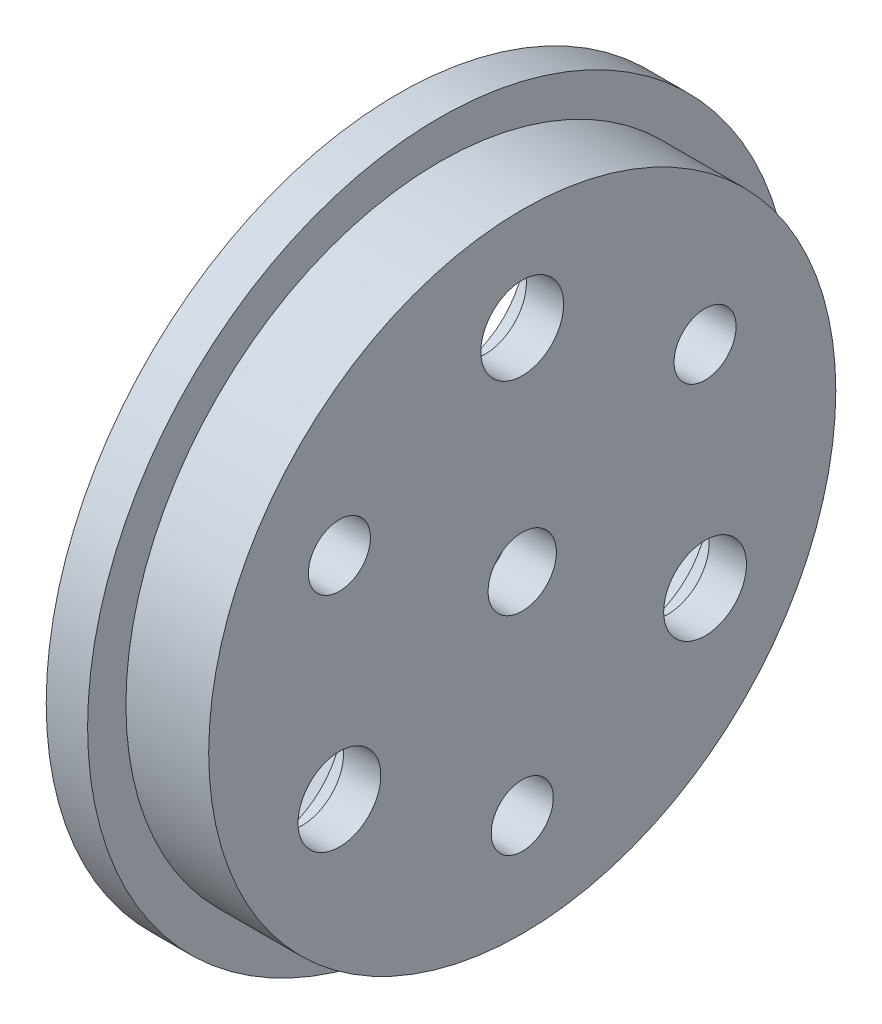
ISO-10303-21;
HEADER;
FILE_DESCRIPTION(('STEP AP214'),'2;1');
FILE_NAME('part.step','',(''),(''),'','','');
FILE_SCHEMA(('AUTOMOTIVE_DESIGN { 1 0 10303 214 1 1 1 1 }'));
ENDSEC;
DATA;
#1=APPLICATION_CONTEXT('core data for automotive mechanical design processes');
#2=APPLICATION_PROTOCOL_DEFINITION('international standard','automotive_design',2000,#1);
#3=PRODUCT_CONTEXT('',#1,'mechanical');
#4=PRODUCT('Part','Part','',(#3));
#5=PRODUCT_RELATED_PRODUCT_CATEGORY('part','',(#4));
#6=PRODUCT_DEFINITION_FORMATION('','',#4);
#7=PRODUCT_DEFINITION_CONTEXT('part definition',#1,'design');
#8=PRODUCT_DEFINITION('design','',#6,#7);
#9=PRODUCT_DEFINITION_SHAPE('','',#8);
#10=(LENGTH_UNIT() NAMED_UNIT(*) SI_UNIT(.MILLI.,.METRE.));
#11=(NAMED_UNIT(*) PLANE_ANGLE_UNIT() SI_UNIT($,.RADIAN.));
#12=(NAMED_UNIT(*) SI_UNIT($,.STERADIAN.) SOLID_ANGLE_UNIT());
#13=UNCERTAINTY_MEASURE_WITH_UNIT(LENGTH_MEASURE(1.E-05),#10,'distance_accuracy_value','');
#14=(GEOMETRIC_REPRESENTATION_CONTEXT(3) GLOBAL_UNCERTAINTY_ASSIGNED_CONTEXT((#13)) GLOBAL_UNIT_ASSIGNED_CONTEXT((#10,
#11,#12)) REPRESENTATION_CONTEXT('',''));
#15=CARTESIAN_POINT('',(0.,0.,0.));
#16=DIRECTION('',(0.,0.,1.));
#17=DIRECTION('',(1.,0.,0.));
#18=AXIS2_PLACEMENT_3D('',#15,#16,#17);
#19=CARTESIAN_POINT('',(2.6,-8.99999999999998,-9.52627944162879));
#20=DIRECTION('',(0.,-1.,0.));
#21=DIRECTION('',(0.,0.,-1.));
#22=AXIS2_PLACEMENT_3D('',#19,#20,#21);
#23=PLANE('',#22);
#24=DIRECTION('',(0.,0.,1.));
#25=VECTOR('',#24,1.);
#26=CARTESIAN_POINT('',(0.,-8.99999999999998,-9.52627944162879));
#27=LINE('',#26,#25);
#28=CARTESIAN_POINT('',(0.,-8.99999999999998,-9.52627944162879));
#29=VERTEX_POINT('',#28);
#30=CARTESIAN_POINT('',(0.,-8.99999999999999,-0.900000000001651));
#31=VERTEX_POINT('',#30);
#32=EDGE_CURVE('E145',#29,#31,#27,.T.);
#33=ORIENTED_EDGE('',*,*,#32,.T.);
#34=DIRECTION('',(1.,0.,0.));
#35=VECTOR('',#34,1.);
#36=CARTESIAN_POINT('',(0.,-8.99999999999999,-0.900000000001652));
#37=LINE('',#36,#35);
#38=CARTESIAN_POINT('',(2.6,-8.99999999999999,-0.900000000001651));
#39=VERTEX_POINT('',#38);
#40=EDGE_CURVE('E126',#31,#39,#37,.T.);
#41=ORIENTED_EDGE('',*,*,#40,.T.);
#42=DIRECTION('',(0.,0.,1.));
#43=VECTOR('',#42,1.);
#44=CARTESIAN_POINT('',(2.6,-8.99999999999998,-9.52627944162879));
#45=LINE('',#44,#43);
#46=CARTESIAN_POINT('',(2.6,-8.99999999999998,-9.52627944162879));
#47=VERTEX_POINT('',#46);
#48=EDGE_CURVE('E188',#47,#39,#45,.T.);
#49=ORIENTED_EDGE('',*,*,#48,.F.);
#50=DIRECTION('',(-1.,0.,0.));
#51=VECTOR('',#50,1.);
#52=CARTESIAN_POINT('',(2.6,-8.99999999999998,-9.52627944162879));
#53=LINE('',#52,#51);
#54=EDGE_CURVE('E152',#47,#29,#53,.T.);
#55=ORIENTED_EDGE('',*,*,#54,.T.);
#56=EDGE_LOOP('',(#33,#41,#49,#55));
#57=FACE_BOUND('',#56,.T.);
#58=ADVANCED_FACE('F39',(#57),#23,.F.);
#59=CARTESIAN_POINT('',(2.6,12.75,-3.03108891324556));
#60=DIRECTION('',(0.,0.500000000000001,-0.866025403784438));
#61=DIRECTION('',(0.,0.866025403784438,0.500000000000001));
#62=AXIS2_PLACEMENT_3D('',#59,#60,#61);
#63=PLANE('',#62);
#64=DIRECTION('',(0.,-0.866025403784438,-0.500000000000001));
#65=VECTOR('',#64,1.);
#66=CARTESIAN_POINT('',(0.,12.75,-3.03108891324556));
#67=LINE('',#66,#65);
#68=CARTESIAN_POINT('',(0.,12.75,-3.03108891324556));
#69=VERTEX_POINT('',#68);
#70=CARTESIAN_POINT('',(0.,5.27942286340726,-7.34422863405923));
#71=VERTEX_POINT('',#70);
#72=EDGE_CURVE('E274',#69,#71,#67,.T.);
#73=ORIENTED_EDGE('',*,*,#72,.T.);
#74=DIRECTION('',(1.,0.,0.));
#75=VECTOR('',#74,1.);
#76=CARTESIAN_POINT('',(0.,5.27942286340726,-7.34422863405923));
#77=LINE('',#76,#75);
#78=CARTESIAN_POINT('',(2.6,5.27942286340726,-7.34422863405923));
#79=VERTEX_POINT('',#78);
#80=EDGE_CURVE('E322',#71,#79,#77,.T.);
#81=ORIENTED_EDGE('',*,*,#80,.T.);
#82=DIRECTION('',(0.,-0.866025403784438,-0.500000000000001));
#83=VECTOR('',#82,1.);
#84=CARTESIAN_POINT('',(2.6,12.75,-3.03108891324556));
#85=LINE('',#84,#83);
#86=CARTESIAN_POINT('',(2.6,12.75,-3.03108891324556));
#87=VERTEX_POINT('',#86);
#88=EDGE_CURVE('E252',#87,#79,#85,.T.);
#89=ORIENTED_EDGE('',*,*,#88,.F.);
#90=DIRECTION('',(-1.,0.,0.));
#91=VECTOR('',#90,1.);
#92=CARTESIAN_POINT('',(2.6,12.75,-3.03108891324556));
#93=LINE('',#92,#91);
#94=EDGE_CURVE('E177',#87,#69,#93,.T.);
#95=ORIENTED_EDGE('',*,*,#94,.T.);
#96=EDGE_LOOP('',(#73,#81,#89,#95));
#97=FACE_BOUND('',#96,.T.);
#98=ADVANCED_FACE('F391',(#97),#63,.F.);
#99=CARTESIAN_POINT('',(2.6,-3.74999999999996,12.5573683548743));
#100=DIRECTION('',(0.,0.5,0.866025403784439));
#101=DIRECTION('',(0.,-0.866025403784439,0.5));
#102=AXIS2_PLACEMENT_3D('',#99,#100,#101);
#103=PLANE('',#102);
#104=DIRECTION('',(0.,0.866025403784439,-0.5));
#105=VECTOR('',#104,1.);
#106=CARTESIAN_POINT('',(0.,-3.74999999999996,12.5573683548743));
#107=LINE('',#106,#105);
#108=CARTESIAN_POINT('',(0.,-3.74999999999996,12.5573683548743));
#109=VERTEX_POINT('',#108);
#110=CARTESIAN_POINT('',(0.,3.72057713659398,8.24422863405995));
#111=VERTEX_POINT('',#110);
#112=EDGE_CURVE('E236',#109,#111,#107,.T.);
#113=ORIENTED_EDGE('',*,*,#112,.T.);
#114=DIRECTION('',(1.,0.,0.));
#115=VECTOR('',#114,1.);
#116=CARTESIAN_POINT('',(0.,3.72057713659398,8.24422863405995));
#117=LINE('',#116,#115);
#118=CARTESIAN_POINT('',(2.6,3.72057713659398,8.24422863405995));
#119=VERTEX_POINT('',#118);
#120=EDGE_CURVE('E224',#111,#119,#117,.T.);
#121=ORIENTED_EDGE('',*,*,#120,.T.);
#122=DIRECTION('',(0.,0.866025403784439,-0.5));
#123=VECTOR('',#122,1.);
#124=CARTESIAN_POINT('',(2.6,-3.74999999999996,12.5573683548743));
#125=LINE('',#124,#123);
#126=CARTESIAN_POINT('',(2.6,-3.74999999999996,12.5573683548743));
#127=VERTEX_POINT('',#126);
#128=EDGE_CURVE('E234',#127,#119,#125,.T.);
#129=ORIENTED_EDGE('',*,*,#128,.F.);
#130=DIRECTION('',(-1.,0.,0.));
#131=VECTOR('',#130,1.);
#132=CARTESIAN_POINT('',(2.6,-3.74999999999996,12.5573683548743));
#133=LINE('',#132,#131);
#134=EDGE_CURVE('E184',#127,#109,#133,.T.);
#135=ORIENTED_EDGE('',*,*,#134,.T.);
#136=EDGE_LOOP('',(#113,#121,#129,#135));
#137=FACE_BOUND('',#136,.T.);
#138=ADVANCED_FACE('F233',(#137),#103,.F.);
#139=CARTESIAN_POINT('',(2.,0.,0.));
#140=DIRECTION('',(-1.,0.,0.));
#141=DIRECTION('',(0.,0.,1.));
#142=AXIS2_PLACEMENT_3D('',#139,#140,#141);
#143=CYLINDRICAL_SURFACE('',#142,17.);
#144=CARTESIAN_POINT('',(2.,0.,0.));
#145=DIRECTION('',(1.,0.,0.));
#146=DIRECTION('',(0.,0.,-1.));
#147=AXIS2_PLACEMENT_3D('',#144,#145,#146);
#148=CIRCLE('',#147,17.);
#149=CARTESIAN_POINT('',(2.,0.,-17.));
#150=VERTEX_POINT('',#149);
#151=EDGE_CURVE('E197',#150,#150,#148,.T.);
#152=ORIENTED_EDGE('',*,*,#151,.F.);
#153=EDGE_LOOP('',(#152));
#154=FACE_BOUND('',#153,.T.);
#155=CARTESIAN_POINT('',(0.,0.,0.));
#156=DIRECTION('',(1.,0.,0.));
#157=DIRECTION('',(0.,0.,-1.));
#158=AXIS2_PLACEMENT_3D('',#155,#156,#157);
#159=CIRCLE('',#158,17.);
#160=CARTESIAN_POINT('',(0.,0.,-17.));
#161=VERTEX_POINT('',#160);
#162=EDGE_CURVE('E192',#161,#161,#159,.T.);
#163=ORIENTED_EDGE('',*,*,#162,.T.);
#164=EDGE_LOOP('',(#163));
#165=FACE_BOUND('',#164,.T.);
#166=ADVANCED_FACE('F41',(#154,#165),#143,.T.);
#167=CARTESIAN_POINT('',(2.,0.,0.));
#168=DIRECTION('',(1.,0.,0.));
#169=DIRECTION('',(0.,0.,-1.));
#170=AXIS2_PLACEMENT_3D('',#167,#168,#169);
#171=PLANE('',#170);
#172=CARTESIAN_POINT('',(2.,0.,0.));
#173=DIRECTION('',(1.,0.,0.));
#174=DIRECTION('',(0.,0.,-1.));
#175=AXIS2_PLACEMENT_3D('',#172,#173,#174);
#176=CIRCLE('',#175,15.15);
#177=CARTESIAN_POINT('',(2.,0.,-15.15));
#178=VERTEX_POINT('',#177);
#179=EDGE_CURVE('E193',#178,#178,#176,.T.);
#180=ORIENTED_EDGE('',*,*,#179,.F.);
#181=EDGE_LOOP('',(#180));
#182=FACE_BOUND('',#181,.T.);
#183=ORIENTED_EDGE('',*,*,#151,.T.);
#184=EDGE_LOOP('',(#183));
#185=FACE_BOUND('',#184,.T.);
#186=ADVANCED_FACE('F415',(#182,#185),#171,.T.);
#187=CARTESIAN_POINT('',(0.,0.,0.));
#188=DIRECTION('',(1.,0.,0.));
#189=DIRECTION('',(0.,0.,-1.));
#190=AXIS2_PLACEMENT_3D('',#187,#188,#189);
#191=PLANE('',#190);
#192=CARTESIAN_POINT('',(0.,3.72057713659391,-8.24422863406001));
#193=VERTEX_POINT('',#192);
#194=CARTESIAN_POINT('',(0.,-3.74999999999994,-12.5573683548743));
#195=VERTEX_POINT('',#194);
#196=EDGE_CURVE('E273',#193,#195,#67,.T.);
#197=ORIENTED_EDGE('',*,*,#196,.F.);
#198=CARTESIAN_POINT('',(0.,5.10000000000077,-8.83345911860127));
#199=DIRECTION('',(1.,0.,0.));
#200=DIRECTION('',(0.,0.,-1.));
#201=AXIS2_PLACEMENT_3D('',#198,#199,#200);
#202=CIRCLE('',#201,1.50000000000076);
#203=EDGE_CURVE('E307',#193,#71,#202,.T.);
#204=ORIENTED_EDGE('',*,*,#203,.T.);
#205=ORIENTED_EDGE('',*,*,#72,.F.);
#206=CARTESIAN_POINT('',(0.,11.,0.));
#207=DIRECTION('',(-1.,0.,0.));
#208=DIRECTION('',(0.,0.,-1.));
#209=AXIS2_PLACEMENT_3D('',#206,#207,#208);
#210=CIRCLE('',#209,3.5);
#211=CARTESIAN_POINT('',(0.,12.75,3.03108891324556));
#212=VERTEX_POINT('',#211);
#213=EDGE_CURVE('E270',#212,#69,#210,.T.);
#214=ORIENTED_EDGE('',*,*,#213,.F.);
#215=CARTESIAN_POINT('',(0.,5.27942286340596,7.34422863405996));
#216=VERTEX_POINT('',#215);
#217=EDGE_CURVE('E266',#216,#212,#107,.T.);
#218=ORIENTED_EDGE('',*,*,#217,.F.);
#219=CARTESIAN_POINT('',(0.,5.09999999999998,8.83345911860129));
#220=DIRECTION('',(1.,0.,0.));
#221=DIRECTION('',(0.,0.,-1.));
#222=AXIS2_PLACEMENT_3D('',#219,#220,#221);
#223=CIRCLE('',#222,1.5);
#224=EDGE_CURVE('E299',#216,#111,#223,.T.);
#225=ORIENTED_EDGE('',*,*,#224,.T.);
#226=ORIENTED_EDGE('',*,*,#112,.F.);
#227=CARTESIAN_POINT('',(0.,-5.5,9.52627944162881));
#228=DIRECTION('',(-1.,0.,0.));
#229=DIRECTION('',(0.,0.,1.));
#230=AXIS2_PLACEMENT_3D('',#227,#228,#229);
#231=CIRCLE('',#230,3.5);
#232=CARTESIAN_POINT('',(0.,-9.,9.52627944162876));
#233=VERTEX_POINT('',#232);
#234=EDGE_CURVE('E263',#233,#109,#231,.T.);
#235=ORIENTED_EDGE('',*,*,#234,.F.);
#236=CARTESIAN_POINT('',(0.,-9.,0.900000000000295));
#237=VERTEX_POINT('',#236);
#238=EDGE_CURVE('E147',#237,#233,#27,.T.);
#239=ORIENTED_EDGE('',*,*,#238,.F.);
#240=CARTESIAN_POINT('',(0.,-10.1999999999996,-6.79383794809744E-13));
#241=DIRECTION('',(1.,0.,0.));
#242=DIRECTION('',(0.,0.,-1.));
#243=AXIS2_PLACEMENT_3D('',#240,#241,#242);
#244=CIRCLE('',#243,1.5000000000003);
#245=EDGE_CURVE('E129',#237,#31,#244,.T.);
#246=ORIENTED_EDGE('',*,*,#245,.T.);
#247=ORIENTED_EDGE('',*,*,#32,.F.);
#248=CARTESIAN_POINT('',(0.,-5.49999999999999,-9.52627944162884));
#249=DIRECTION('',(-1.,0.,0.));
#250=DIRECTION('',(0.,0.,1.));
#251=AXIS2_PLACEMENT_3D('',#248,#249,#250);
#252=CIRCLE('',#251,3.5);
#253=EDGE_CURVE('E162',#195,#29,#252,.T.);
#254=ORIENTED_EDGE('',*,*,#253,.F.);
#255=EDGE_LOOP('',(#197,#204,#205,#214,#218,#225,#226,#235,#239,#246,#247,#254));
#256=FACE_BOUND('',#255,.T.);
#257=ORIENTED_EDGE('',*,*,#162,.F.);
#258=EDGE_LOOP('',(#257));
#259=FACE_BOUND('',#258,.T.);
#260=ADVANCED_FACE('F142',(#256,#259),#191,.F.);
#261=CARTESIAN_POINT('',(6.,0.,0.));
#262=DIRECTION('',(-1.,0.,0.));
#263=DIRECTION('',(0.,0.,1.));
#264=AXIS2_PLACEMENT_3D('',#261,#262,#263);
#265=CYLINDRICAL_SURFACE('',#264,15.15);
#266=CARTESIAN_POINT('',(6.,0.,0.));
#267=DIRECTION('',(1.,0.,0.));
#268=DIRECTION('',(0.,0.,-1.));
#269=AXIS2_PLACEMENT_3D('',#266,#267,#268);
#270=CIRCLE('',#269,15.15);
#271=CARTESIAN_POINT('',(6.,0.,-15.15));
#272=VERTEX_POINT('',#271);
#273=EDGE_CURVE('E170',#272,#272,#270,.T.);
#274=ORIENTED_EDGE('',*,*,#273,.F.);
#275=EDGE_LOOP('',(#274));
#276=FACE_BOUND('',#275,.T.);
#277=ORIENTED_EDGE('',*,*,#179,.T.);
#278=EDGE_LOOP('',(#277));
#279=FACE_BOUND('',#278,.T.);
#280=ADVANCED_FACE('F407',(#276,#279),#265,.T.);
#281=CARTESIAN_POINT('',(6.,0.,0.));
#282=DIRECTION('',(1.,0.,0.));
#283=DIRECTION('',(0.,0.,-1.));
#284=AXIS2_PLACEMENT_3D('',#281,#282,#283);
#285=PLANE('',#284);
#286=CARTESIAN_POINT('',(6.,5.10000000000077,-8.83345911860127));
#287=DIRECTION('',(1.,0.,0.));
#288=DIRECTION('',(0.,0.,-1.));
#289=AXIS2_PLACEMENT_3D('',#286,#287,#288);
#290=CIRCLE('',#289,1.50000000000076);
#291=CARTESIAN_POINT('',(6.,5.10000000000077,-10.333459118602));
#292=VERTEX_POINT('',#291);
#293=EDGE_CURVE('E302',#292,#292,#290,.T.);
#294=ORIENTED_EDGE('',*,*,#293,.F.);
#295=EDGE_LOOP('',(#294));
#296=FACE_BOUND('',#295,.T.);
#297=CARTESIAN_POINT('',(6.,5.09999999999998,8.83345911860129));
#298=DIRECTION('',(1.,0.,0.));
#299=DIRECTION('',(0.,0.,-1.));
#300=AXIS2_PLACEMENT_3D('',#297,#298,#299);
#301=CIRCLE('',#300,1.5);
#302=CARTESIAN_POINT('',(6.,5.09999999999998,7.33345911860129));
#303=VERTEX_POINT('',#302);
#304=EDGE_CURVE('E149',#303,#303,#301,.T.);
#305=ORIENTED_EDGE('',*,*,#304,.F.);
#306=EDGE_LOOP('',(#305));
#307=FACE_BOUND('',#306,.T.);
#308=CARTESIAN_POINT('',(6.,-10.1999999999996,-6.79383794809744E-13));
#309=DIRECTION('',(1.,0.,0.));
#310=DIRECTION('',(0.,0.,-1.));
#311=AXIS2_PLACEMENT_3D('',#308,#309,#310);
#312=CIRCLE('',#311,1.5000000000003);
#313=CARTESIAN_POINT('',(6.,-10.1999999999996,-1.50000000000097));
#314=VERTEX_POINT('',#313);
#315=EDGE_CURVE('E150',#314,#314,#312,.T.);
#316=ORIENTED_EDGE('',*,*,#315,.F.);
#317=EDGE_LOOP('',(#316));
#318=FACE_BOUND('',#317,.T.);
#319=CARTESIAN_POINT('',(6.,0.,0.));
#320=DIRECTION('',(-1.,0.,0.));
#321=DIRECTION('',(0.,0.,1.));
#322=AXIS2_PLACEMENT_3D('',#319,#320,#321);
#323=CIRCLE('',#322,1.65);
#324=CARTESIAN_POINT('',(6.,0.,1.65));
#325=VERTEX_POINT('',#324);
#326=EDGE_CURVE('E326',#325,#325,#323,.T.);
#327=ORIENTED_EDGE('',*,*,#326,.T.);
#328=EDGE_LOOP('',(#327));
#329=FACE_BOUND('',#328,.T.);
#330=CARTESIAN_POINT('',(6.,-5.10000000000036,8.83345911860179));
#331=DIRECTION('',(-1.,0.,0.));
#332=DIRECTION('',(0.,0.,1.));
#333=AXIS2_PLACEMENT_3D('',#330,#331,#332);
#334=CIRCLE('',#333,2.);
#335=CARTESIAN_POINT('',(6.,-5.10000000000036,10.8334591186018));
#336=VERTEX_POINT('',#335);
#337=EDGE_CURVE('E209',#336,#336,#334,.T.);
#338=ORIENTED_EDGE('',*,*,#337,.T.);
#339=EDGE_LOOP('',(#338));
#340=FACE_BOUND('',#339,.T.);
#341=CARTESIAN_POINT('',(6.,10.2000000000006,0.));
#342=DIRECTION('',(-1.,0.,0.));
#343=DIRECTION('',(0.,0.,1.));
#344=AXIS2_PLACEMENT_3D('',#341,#342,#343);
#345=CIRCLE('',#344,2.);
#346=CARTESIAN_POINT('',(6.,10.2000000000006,2.00000000000001));
#347=VERTEX_POINT('',#346);
#348=EDGE_CURVE('E345',#347,#347,#345,.T.);
#349=ORIENTED_EDGE('',*,*,#348,.T.);
#350=EDGE_LOOP('',(#349));
#351=FACE_BOUND('',#350,.T.);
#352=CARTESIAN_POINT('',(6.,-5.10000000000022,-8.83345911860187));
#353=DIRECTION('',(-1.,0.,0.));
#354=DIRECTION('',(0.,0.,1.));
#355=AXIS2_PLACEMENT_3D('',#352,#353,#354);
#356=CIRCLE('',#355,2.);
#357=CARTESIAN_POINT('',(6.,-5.10000000000022,-6.83345911860187));
#358=VERTEX_POINT('',#357);
#359=EDGE_CURVE('E338',#358,#358,#356,.T.);
#360=ORIENTED_EDGE('',*,*,#359,.T.);
#361=EDGE_LOOP('',(#360));
#362=FACE_BOUND('',#361,.T.);
#363=ORIENTED_EDGE('',*,*,#273,.T.);
#364=EDGE_LOOP('',(#363));
#365=FACE_BOUND('',#364,.T.);
#366=ADVANCED_FACE('F402',(#296,#307,#318,#329,#340,#351,#362,#365),#285,.T.);
#367=CARTESIAN_POINT('',(2.6,-5.5,9.52627944162881));
#368=DIRECTION('',(-1.,0.,0.));
#369=DIRECTION('',(0.,0.,1.));
#370=AXIS2_PLACEMENT_3D('',#367,#368,#369);
#371=CYLINDRICAL_SURFACE('',#370,3.5);
#372=ORIENTED_EDGE('',*,*,#234,.T.);
#373=ORIENTED_EDGE('',*,*,#134,.F.);
#374=CARTESIAN_POINT('',(2.6,-5.5,9.52627944162881));
#375=DIRECTION('',(-1.,0.,0.));
#376=DIRECTION('',(0.,0.,1.));
#377=AXIS2_PLACEMENT_3D('',#374,#375,#376);
#378=CIRCLE('',#377,3.5);
#379=CARTESIAN_POINT('',(2.6,-9.,9.52627944162876));
#380=VERTEX_POINT('',#379);
#381=EDGE_CURVE('E155',#380,#127,#378,.T.);
#382=ORIENTED_EDGE('',*,*,#381,.F.);
#383=DIRECTION('',(-1.,0.,0.));
#384=VECTOR('',#383,1.);
#385=CARTESIAN_POINT('',(2.6,-9.,9.52627944162876));
#386=LINE('',#385,#384);
#387=EDGE_CURVE('E166',#380,#233,#386,.T.);
#388=ORIENTED_EDGE('',*,*,#387,.T.);
#389=EDGE_LOOP('',(#372,#373,#382,#388));
#390=FACE_BOUND('',#389,.T.);
#391=ADVANCED_FACE('F297',(#390),#371,.F.);
#392=CARTESIAN_POINT('',(2.6,-9.,0.900000000000295));
#393=VERTEX_POINT('',#392);
#394=EDGE_CURVE('E260',#393,#380,#45,.T.);
#395=ORIENTED_EDGE('',*,*,#394,.F.);
#396=DIRECTION('',(1.,0.,0.));
#397=VECTOR('',#396,1.);
#398=CARTESIAN_POINT('',(0.,-9.,0.900000000000296));
#399=LINE('',#398,#397);
#400=EDGE_CURVE('E55',#393,#237,#399,.F.);
#401=ORIENTED_EDGE('',*,*,#400,.T.);
#402=ORIENTED_EDGE('',*,*,#238,.T.);
#403=ORIENTED_EDGE('',*,*,#387,.F.);
#404=EDGE_LOOP('',(#395,#401,#402,#403));
#405=FACE_BOUND('',#404,.T.);
#406=ADVANCED_FACE('F295',(#405),#23,.F.);
#407=CARTESIAN_POINT('',(2.6,-5.49999999999999,-9.52627944162884));
#408=DIRECTION('',(-1.,0.,0.));
#409=DIRECTION('',(0.,0.,1.));
#410=AXIS2_PLACEMENT_3D('',#407,#408,#409);
#411=CYLINDRICAL_SURFACE('',#410,3.5);
#412=ORIENTED_EDGE('',*,*,#253,.T.);
#413=ORIENTED_EDGE('',*,*,#54,.F.);
#414=CARTESIAN_POINT('',(2.6,-5.49999999999999,-9.52627944162884));
#415=DIRECTION('',(-1.,0.,0.));
#416=DIRECTION('',(0.,0.,1.));
#417=AXIS2_PLACEMENT_3D('',#414,#415,#416);
#418=CIRCLE('',#417,3.5);
#419=CARTESIAN_POINT('',(2.6,-3.74999999999994,-12.5573683548743));
#420=VERTEX_POINT('',#419);
#421=EDGE_CURVE('E256',#420,#47,#418,.T.);
#422=ORIENTED_EDGE('',*,*,#421,.F.);
#423=DIRECTION('',(-1.,0.,0.));
#424=VECTOR('',#423,1.);
#425=CARTESIAN_POINT('',(2.6,-3.74999999999994,-12.5573683548743));
#426=LINE('',#425,#424);
#427=EDGE_CURVE('E173',#420,#195,#426,.T.);
#428=ORIENTED_EDGE('',*,*,#427,.T.);
#429=EDGE_LOOP('',(#412,#413,#422,#428));
#430=FACE_BOUND('',#429,.T.);
#431=ADVANCED_FACE('F289',(#430),#411,.F.);
#432=CARTESIAN_POINT('',(2.6,3.72057713659391,-8.24422863406001));
#433=VERTEX_POINT('',#432);
#434=EDGE_CURVE('E248',#433,#420,#85,.T.);
#435=ORIENTED_EDGE('',*,*,#434,.F.);
#436=DIRECTION('',(1.,0.,0.));
#437=VECTOR('',#436,1.);
#438=CARTESIAN_POINT('',(0.,3.72057713659391,-8.24422863406001));
#439=LINE('',#438,#437);
#440=EDGE_CURVE('E62',#433,#193,#439,.F.);
#441=ORIENTED_EDGE('',*,*,#440,.T.);
#442=ORIENTED_EDGE('',*,*,#196,.T.);
#443=ORIENTED_EDGE('',*,*,#427,.F.);
#444=EDGE_LOOP('',(#435,#441,#442,#443));
#445=FACE_BOUND('',#444,.T.);
#446=ADVANCED_FACE('F285',(#445),#63,.F.);
#447=CARTESIAN_POINT('',(2.6,11.,0.));
#448=DIRECTION('',(-1.,0.,0.));
#449=DIRECTION('',(0.,0.,1.));
#450=AXIS2_PLACEMENT_3D('',#447,#448,#449);
#451=CYLINDRICAL_SURFACE('',#450,3.5);
#452=ORIENTED_EDGE('',*,*,#213,.T.);
#453=ORIENTED_EDGE('',*,*,#94,.F.);
#454=CARTESIAN_POINT('',(2.6,11.,0.));
#455=DIRECTION('',(-1.,0.,0.));
#456=DIRECTION('',(0.,0.,-1.));
#457=AXIS2_PLACEMENT_3D('',#454,#455,#456);
#458=CIRCLE('',#457,3.5);
#459=CARTESIAN_POINT('',(2.6,12.75,3.03108891324556));
#460=VERTEX_POINT('',#459);
#461=EDGE_CURVE('E243',#460,#87,#458,.T.);
#462=ORIENTED_EDGE('',*,*,#461,.F.);
#463=DIRECTION('',(-1.,0.,0.));
#464=VECTOR('',#463,1.);
#465=CARTESIAN_POINT('',(2.6,12.75,3.03108891324556));
#466=LINE('',#465,#464);
#467=EDGE_CURVE('E180',#460,#212,#466,.T.);
#468=ORIENTED_EDGE('',*,*,#467,.T.);
#469=EDGE_LOOP('',(#452,#453,#462,#468));
#470=FACE_BOUND('',#469,.T.);
#471=ADVANCED_FACE('F386',(#470),#451,.F.);
#472=CARTESIAN_POINT('',(2.6,5.27942286340596,7.34422863405996));
#473=VERTEX_POINT('',#472);
#474=EDGE_CURVE('E160',#473,#460,#125,.T.);
#475=ORIENTED_EDGE('',*,*,#474,.F.);
#476=DIRECTION('',(1.,0.,0.));
#477=VECTOR('',#476,1.);
#478=CARTESIAN_POINT('',(0.,5.27942286340596,7.34422863405996));
#479=LINE('',#478,#477);
#480=EDGE_CURVE('E136',#473,#216,#479,.F.);
#481=ORIENTED_EDGE('',*,*,#480,.T.);
#482=ORIENTED_EDGE('',*,*,#217,.T.);
#483=ORIENTED_EDGE('',*,*,#467,.F.);
#484=EDGE_LOOP('',(#475,#481,#482,#483));
#485=FACE_BOUND('',#484,.T.);
#486=ADVANCED_FACE('F377',(#485),#103,.F.);
#487=CARTESIAN_POINT('',(2.6,-5.5,9.52627944162881));
#488=DIRECTION('',(-1.,0.,0.));
#489=DIRECTION('',(0.,0.,1.));
#490=AXIS2_PLACEMENT_3D('',#487,#488,#489);
#491=PLANE('',#490);
#492=CARTESIAN_POINT('',(2.6,5.10000000000077,-8.83345911860127));
#493=DIRECTION('',(-1.,0.,0.));
#494=DIRECTION('',(0.,0.,1.));
#495=AXIS2_PLACEMENT_3D('',#492,#493,#494);
#496=CIRCLE('',#495,1.50000000000076);
#497=EDGE_CURVE('E11',#433,#79,#496,.T.);
#498=ORIENTED_EDGE('',*,*,#497,.F.);
#499=ORIENTED_EDGE('',*,*,#434,.T.);
#500=ORIENTED_EDGE('',*,*,#421,.T.);
#501=ORIENTED_EDGE('',*,*,#48,.T.);
#502=CARTESIAN_POINT('',(2.6,-10.1999999999996,-6.79383794809744E-13));
#503=DIRECTION('',(-1.,0.,0.));
#504=DIRECTION('',(0.,0.,1.));
#505=AXIS2_PLACEMENT_3D('',#502,#503,#504);
#506=CIRCLE('',#505,1.5000000000003);
#507=EDGE_CURVE('E130',#393,#39,#506,.T.);
#508=ORIENTED_EDGE('',*,*,#507,.F.);
#509=ORIENTED_EDGE('',*,*,#394,.T.);
#510=ORIENTED_EDGE('',*,*,#381,.T.);
#511=ORIENTED_EDGE('',*,*,#128,.T.);
#512=CARTESIAN_POINT('',(2.6,5.09999999999998,8.83345911860129));
#513=DIRECTION('',(-1.,0.,0.));
#514=DIRECTION('',(0.,0.,1.));
#515=AXIS2_PLACEMENT_3D('',#512,#513,#514);
#516=CIRCLE('',#515,1.5);
#517=EDGE_CURVE('E48',#473,#119,#516,.T.);
#518=ORIENTED_EDGE('',*,*,#517,.F.);
#519=ORIENTED_EDGE('',*,*,#474,.T.);
#520=ORIENTED_EDGE('',*,*,#461,.T.);
#521=ORIENTED_EDGE('',*,*,#88,.T.);
#522=EDGE_LOOP('',(#498,#499,#500,#501,#508,#509,#510,#511,#518,#519,#520,#521));
#523=FACE_BOUND('',#522,.T.);
#524=CARTESIAN_POINT('',(2.6,0.,0.));
#525=DIRECTION('',(-1.,0.,0.));
#526=DIRECTION('',(0.,0.,1.));
#527=AXIS2_PLACEMENT_3D('',#524,#525,#526);
#528=CIRCLE('',#527,5.5);
#529=CARTESIAN_POINT('',(2.6,0.,5.5));
#530=VERTEX_POINT('',#529);
#531=EDGE_CURVE('E330',#530,#530,#528,.T.);
#532=ORIENTED_EDGE('',*,*,#531,.F.);
#533=EDGE_LOOP('',(#532));
#534=FACE_BOUND('',#533,.T.);
#535=CARTESIAN_POINT('',(2.6,-5.10000000000032,8.83345911860181));
#536=DIRECTION('',(-1.,0.,0.));
#537=DIRECTION('',(0.,0.,1.));
#538=AXIS2_PLACEMENT_3D('',#535,#536,#537);
#539=CIRCLE('',#538,3.54999999999986);
#540=CARTESIAN_POINT('',(2.6,-5.10000000000032,12.3834591186017));
#541=VERTEX_POINT('',#540);
#542=EDGE_CURVE('E355',#541,#541,#539,.T.);
#543=ORIENTED_EDGE('',*,*,#542,.F.);
#544=EDGE_LOOP('',(#543));
#545=FACE_BOUND('',#544,.T.);
#546=CARTESIAN_POINT('',(2.6,10.2000000000006,0.));
#547=DIRECTION('',(-1.,0.,0.));
#548=DIRECTION('',(0.,0.,1.));
#549=AXIS2_PLACEMENT_3D('',#546,#547,#548);
#550=CIRCLE('',#549,3.54999999999981);
#551=CARTESIAN_POINT('',(2.6,10.2000000000006,3.54999999999982));
#552=VERTEX_POINT('',#551);
#553=EDGE_CURVE('E363',#552,#552,#550,.T.);
#554=ORIENTED_EDGE('',*,*,#553,.F.);
#555=EDGE_LOOP('',(#554));
#556=FACE_BOUND('',#555,.T.);
#557=CARTESIAN_POINT('',(2.6,-5.10000000000031,-8.83345911860182));
#558=DIRECTION('',(-1.,0.,0.));
#559=DIRECTION('',(0.,0.,1.));
#560=AXIS2_PLACEMENT_3D('',#557,#558,#559);
#561=CIRCLE('',#560,3.54999999999991);
#562=CARTESIAN_POINT('',(2.6,-5.10000000000031,-5.28345911860191));
#563=VERTEX_POINT('',#562);
#564=EDGE_CURVE('E217',#563,#563,#561,.T.);
#565=ORIENTED_EDGE('',*,*,#564,.F.);
#566=EDGE_LOOP('',(#565));
#567=FACE_BOUND('',#566,.T.);
#568=ADVANCED_FACE('F239',(#523,#534,#545,#556,#567),#491,.T.);
#569=CARTESIAN_POINT('',(4.2,-5.10000000000031,-8.83345911860182));
#570=DIRECTION('',(-1.,0.,0.));
#571=DIRECTION('',(0.,0.,1.));
#572=AXIS2_PLACEMENT_3D('',#569,#570,#571);
#573=CYLINDRICAL_SURFACE('',#572,3.54999999999991);
#574=CARTESIAN_POINT('',(4.2,-5.10000000000031,-8.83345911860182));
#575=DIRECTION('',(-1.,0.,0.));
#576=DIRECTION('',(0.,0.,1.));
#577=AXIS2_PLACEMENT_3D('',#574,#575,#576);
#578=CIRCLE('',#577,3.54999999999991);
#579=CARTESIAN_POINT('',(4.2,-5.10000000000031,-5.28345911860191));
#580=VERTEX_POINT('',#579);
#581=EDGE_CURVE('E367',#580,#580,#578,.T.);
#582=ORIENTED_EDGE('',*,*,#581,.F.);
#583=EDGE_LOOP('',(#582));
#584=FACE_BOUND('',#583,.T.);
#585=ORIENTED_EDGE('',*,*,#564,.T.);
#586=EDGE_LOOP('',(#585));
#587=FACE_BOUND('',#586,.T.);
#588=ADVANCED_FACE('F374',(#584,#587),#573,.F.);
#589=CARTESIAN_POINT('',(4.2,0.,0.));
#590=DIRECTION('',(-1.,0.,0.));
#591=DIRECTION('',(0.,0.,1.));
#592=AXIS2_PLACEMENT_3D('',#589,#590,#591);
#593=PLANE('',#592);
#594=CARTESIAN_POINT('',(4.2,-5.10000000000022,-8.83345911860187));
#595=DIRECTION('',(-1.,0.,0.));
#596=DIRECTION('',(0.,0.,1.));
#597=AXIS2_PLACEMENT_3D('',#594,#595,#596);
#598=CIRCLE('',#597,2.);
#599=CARTESIAN_POINT('',(4.2,-5.10000000000022,-6.83345911860187));
#600=VERTEX_POINT('',#599);
#601=EDGE_CURVE('E213',#600,#600,#598,.T.);
#602=ORIENTED_EDGE('',*,*,#601,.F.);
#603=EDGE_LOOP('',(#602));
#604=FACE_BOUND('',#603,.T.);
#605=ORIENTED_EDGE('',*,*,#581,.T.);
#606=EDGE_LOOP('',(#605));
#607=FACE_BOUND('',#606,.T.);
#608=ADVANCED_FACE('F383',(#604,#607),#593,.T.);
#609=CARTESIAN_POINT('',(4.2,10.2000000000006,0.));
#610=DIRECTION('',(-1.,0.,0.));
#611=DIRECTION('',(0.,0.,1.));
#612=AXIS2_PLACEMENT_3D('',#609,#610,#611);
#613=CYLINDRICAL_SURFACE('',#612,3.54999999999981);
#614=CARTESIAN_POINT('',(4.2,10.2000000000006,0.));
#615=DIRECTION('',(-1.,0.,0.));
#616=DIRECTION('',(0.,0.,1.));
#617=AXIS2_PLACEMENT_3D('',#614,#615,#616);
#618=CIRCLE('',#617,3.54999999999981);
#619=CARTESIAN_POINT('',(4.2,10.2000000000006,3.54999999999982));
#620=VERTEX_POINT('',#619);
#621=EDGE_CURVE('E359',#620,#620,#618,.T.);
#622=ORIENTED_EDGE('',*,*,#621,.F.);
#623=EDGE_LOOP('',(#622));
#624=FACE_BOUND('',#623,.T.);
#625=ORIENTED_EDGE('',*,*,#553,.T.);
#626=EDGE_LOOP('',(#625));
#627=FACE_BOUND('',#626,.T.);
#628=ADVANCED_FACE('F528',(#624,#627),#613,.F.);
#629=CARTESIAN_POINT('',(4.2,0.,0.));
#630=DIRECTION('',(-1.,0.,0.));
#631=DIRECTION('',(0.,0.,1.));
#632=AXIS2_PLACEMENT_3D('',#629,#630,#631);
#633=PLANE('',#632);
#634=CARTESIAN_POINT('',(4.2,10.2000000000006,0.));
#635=DIRECTION('',(-1.,0.,0.));
#636=DIRECTION('',(0.,0.,1.));
#637=AXIS2_PLACEMENT_3D('',#634,#635,#636);
#638=CIRCLE('',#637,2.);
#639=CARTESIAN_POINT('',(4.2,10.2000000000006,2.00000000000001));
#640=VERTEX_POINT('',#639);
#641=EDGE_CURVE('E208',#640,#640,#638,.T.);
#642=ORIENTED_EDGE('',*,*,#641,.F.);
#643=EDGE_LOOP('',(#642));
#644=FACE_BOUND('',#643,.T.);
#645=ORIENTED_EDGE('',*,*,#621,.T.);
#646=EDGE_LOOP('',(#645));
#647=FACE_BOUND('',#646,.T.);
#648=ADVANCED_FACE('F524',(#644,#647),#633,.T.);
#649=CARTESIAN_POINT('',(4.2,-5.10000000000032,8.83345911860181));
#650=DIRECTION('',(-1.,0.,0.));
#651=DIRECTION('',(0.,0.,1.));
#652=AXIS2_PLACEMENT_3D('',#649,#650,#651);
#653=CYLINDRICAL_SURFACE('',#652,3.54999999999986);
#654=CARTESIAN_POINT('',(4.2,-5.10000000000032,8.83345911860181));
#655=DIRECTION('',(-1.,0.,0.));
#656=DIRECTION('',(0.,0.,1.));
#657=AXIS2_PLACEMENT_3D('',#654,#655,#656);
#658=CIRCLE('',#657,3.54999999999986);
#659=CARTESIAN_POINT('',(4.2,-5.10000000000032,12.3834591186017));
#660=VERTEX_POINT('',#659);
#661=EDGE_CURVE('E267',#660,#660,#658,.T.);
#662=ORIENTED_EDGE('',*,*,#661,.F.);
#663=EDGE_LOOP('',(#662));
#664=FACE_BOUND('',#663,.T.);
#665=ORIENTED_EDGE('',*,*,#542,.T.);
#666=EDGE_LOOP('',(#665));
#667=FACE_BOUND('',#666,.T.);
#668=ADVANCED_FACE('F520',(#664,#667),#653,.F.);
#669=CARTESIAN_POINT('',(4.2,0.,0.));
#670=DIRECTION('',(-1.,0.,0.));
#671=DIRECTION('',(0.,0.,1.));
#672=AXIS2_PLACEMENT_3D('',#669,#670,#671);
#673=PLANE('',#672);
#674=CARTESIAN_POINT('',(4.2,-5.10000000000036,8.83345911860179));
#675=DIRECTION('',(-1.,0.,0.));
#676=DIRECTION('',(0.,0.,1.));
#677=AXIS2_PLACEMENT_3D('',#674,#675,#676);
#678=CIRCLE('',#677,2.);
#679=CARTESIAN_POINT('',(4.2,-5.10000000000036,10.8334591186018));
#680=VERTEX_POINT('',#679);
#681=EDGE_CURVE('E204',#680,#680,#678,.T.);
#682=ORIENTED_EDGE('',*,*,#681,.F.);
#683=EDGE_LOOP('',(#682));
#684=FACE_BOUND('',#683,.T.);
#685=ORIENTED_EDGE('',*,*,#661,.T.);
#686=EDGE_LOOP('',(#685));
#687=FACE_BOUND('',#686,.T.);
#688=ADVANCED_FACE('F510',(#684,#687),#673,.T.);
#689=CARTESIAN_POINT('',(6.,-5.10000000000036,8.83345911860179));
#690=DIRECTION('',(-1.,0.,0.));
#691=DIRECTION('',(0.,0.,1.));
#692=AXIS2_PLACEMENT_3D('',#689,#690,#691);
#693=CYLINDRICAL_SURFACE('',#692,2.);
#694=ORIENTED_EDGE('',*,*,#681,.T.);
#695=EDGE_LOOP('',(#694));
#696=FACE_BOUND('',#695,.T.);
#697=ORIENTED_EDGE('',*,*,#337,.F.);
#698=EDGE_LOOP('',(#697));
#699=FACE_BOUND('',#698,.T.);
#700=ADVANCED_FACE('F506',(#696,#699),#693,.F.);
#701=CARTESIAN_POINT('',(6.,10.2000000000006,0.));
#702=DIRECTION('',(-1.,0.,0.));
#703=DIRECTION('',(0.,0.,1.));
#704=AXIS2_PLACEMENT_3D('',#701,#702,#703);
#705=CYLINDRICAL_SURFACE('',#704,2.);
#706=ORIENTED_EDGE('',*,*,#641,.T.);
#707=EDGE_LOOP('',(#706));
#708=FACE_BOUND('',#707,.T.);
#709=ORIENTED_EDGE('',*,*,#348,.F.);
#710=EDGE_LOOP('',(#709));
#711=FACE_BOUND('',#710,.T.);
#712=ADVANCED_FACE('F509',(#708,#711),#705,.F.);
#713=CARTESIAN_POINT('',(6.,-5.10000000000022,-8.83345911860187));
#714=DIRECTION('',(-1.,0.,0.));
#715=DIRECTION('',(0.,0.,1.));
#716=AXIS2_PLACEMENT_3D('',#713,#714,#715);
#717=CYLINDRICAL_SURFACE('',#716,2.);
#718=ORIENTED_EDGE('',*,*,#601,.T.);
#719=EDGE_LOOP('',(#718));
#720=FACE_BOUND('',#719,.T.);
#721=ORIENTED_EDGE('',*,*,#359,.F.);
#722=EDGE_LOOP('',(#721));
#723=FACE_BOUND('',#722,.T.);
#724=ADVANCED_FACE('F504',(#720,#723),#717,.F.);
#725=CARTESIAN_POINT('',(3.7,0.,0.));
#726=DIRECTION('',(-1.,0.,0.));
#727=DIRECTION('',(0.,0.,1.));
#728=AXIS2_PLACEMENT_3D('',#725,#726,#727);
#729=CYLINDRICAL_SURFACE('',#728,5.5);
#730=CARTESIAN_POINT('',(3.7,0.,0.));
#731=DIRECTION('',(-1.,0.,0.));
#732=DIRECTION('',(0.,0.,1.));
#733=AXIS2_PLACEMENT_3D('',#730,#731,#732);
#734=CIRCLE('',#733,5.5);
#735=CARTESIAN_POINT('',(3.7,0.,5.5));
#736=VERTEX_POINT('',#735);
#737=EDGE_CURVE('E334',#736,#736,#734,.T.);
#738=ORIENTED_EDGE('',*,*,#737,.F.);
#739=EDGE_LOOP('',(#738));
#740=FACE_BOUND('',#739,.T.);
#741=ORIENTED_EDGE('',*,*,#531,.T.);
#742=EDGE_LOOP('',(#741));
#743=FACE_BOUND('',#742,.T.);
#744=ADVANCED_FACE('F500',(#740,#743),#729,.F.);
#745=CARTESIAN_POINT('',(3.7,0.,0.));
#746=DIRECTION('',(-1.,0.,0.));
#747=DIRECTION('',(0.,0.,1.));
#748=AXIS2_PLACEMENT_3D('',#745,#746,#747);
#749=PLANE('',#748);
#750=CARTESIAN_POINT('',(3.7,0.,0.));
#751=DIRECTION('',(-1.,0.,0.));
#752=DIRECTION('',(0.,0.,1.));
#753=AXIS2_PLACEMENT_3D('',#750,#751,#752);
#754=CIRCLE('',#753,1.65);
#755=CARTESIAN_POINT('',(3.7,0.,1.65));
#756=VERTEX_POINT('',#755);
#757=EDGE_CURVE('E325',#756,#756,#754,.T.);
#758=ORIENTED_EDGE('',*,*,#757,.F.);
#759=EDGE_LOOP('',(#758));
#760=FACE_BOUND('',#759,.T.);
#761=ORIENTED_EDGE('',*,*,#737,.T.);
#762=EDGE_LOOP('',(#761));
#763=FACE_BOUND('',#762,.T.);
#764=ADVANCED_FACE('F496',(#760,#763),#749,.T.);
#765=CARTESIAN_POINT('',(6.,0.,0.));
#766=DIRECTION('',(-1.,0.,0.));
#767=DIRECTION('',(0.,0.,1.));
#768=AXIS2_PLACEMENT_3D('',#765,#766,#767);
#769=CYLINDRICAL_SURFACE('',#768,1.65);
#770=ORIENTED_EDGE('',*,*,#326,.F.);
#771=EDGE_LOOP('',(#770));
#772=FACE_BOUND('',#771,.T.);
#773=ORIENTED_EDGE('',*,*,#757,.T.);
#774=EDGE_LOOP('',(#773));
#775=FACE_BOUND('',#774,.T.);
#776=ADVANCED_FACE('F468',(#772,#775),#769,.F.);
#777=CARTESIAN_POINT('',(0.,-10.1999999999996,-6.79383794809744E-13));
#778=DIRECTION('',(1.,0.,0.));
#779=DIRECTION('',(0.,0.,-1.));
#780=AXIS2_PLACEMENT_3D('',#777,#778,#779);
#781=CYLINDRICAL_SURFACE('',#780,1.5000000000003);
#782=ORIENTED_EDGE('',*,*,#315,.T.);
#783=EDGE_LOOP('',(#782));
#784=FACE_BOUND('',#783,.T.);
#785=ORIENTED_EDGE('',*,*,#245,.F.);
#786=ORIENTED_EDGE('',*,*,#400,.F.);
#787=ORIENTED_EDGE('',*,*,#507,.T.);
#788=ORIENTED_EDGE('',*,*,#40,.F.);
#789=EDGE_LOOP('',(#785,#786,#787,#788));
#790=FACE_BOUND('',#789,.T.);
#791=ADVANCED_FACE('F128',(#784,#790),#781,.F.);
#792=CARTESIAN_POINT('',(0.,5.09999999999998,8.83345911860129));
#793=DIRECTION('',(1.,0.,0.));
#794=DIRECTION('',(0.,0.,-1.));
#795=AXIS2_PLACEMENT_3D('',#792,#793,#794);
#796=CYLINDRICAL_SURFACE('',#795,1.5);
#797=ORIENTED_EDGE('',*,*,#304,.T.);
#798=EDGE_LOOP('',(#797));
#799=FACE_BOUND('',#798,.T.);
#800=ORIENTED_EDGE('',*,*,#224,.F.);
#801=ORIENTED_EDGE('',*,*,#480,.F.);
#802=ORIENTED_EDGE('',*,*,#517,.T.);
#803=ORIENTED_EDGE('',*,*,#120,.F.);
#804=EDGE_LOOP('',(#800,#801,#802,#803));
#805=FACE_BOUND('',#804,.T.);
#806=ADVANCED_FACE('F223',(#799,#805),#796,.F.);
#807=CARTESIAN_POINT('',(0.,5.10000000000077,-8.83345911860127));
#808=DIRECTION('',(1.,0.,0.));
#809=DIRECTION('',(0.,0.,-1.));
#810=AXIS2_PLACEMENT_3D('',#807,#808,#809);
#811=CYLINDRICAL_SURFACE('',#810,1.50000000000076);
#812=ORIENTED_EDGE('',*,*,#293,.T.);
#813=EDGE_LOOP('',(#812));
#814=FACE_BOUND('',#813,.T.);
#815=ORIENTED_EDGE('',*,*,#203,.F.);
#816=ORIENTED_EDGE('',*,*,#440,.F.);
#817=ORIENTED_EDGE('',*,*,#497,.T.);
#818=ORIENTED_EDGE('',*,*,#80,.F.);
#819=EDGE_LOOP('',(#815,#816,#817,#818));
#820=FACE_BOUND('',#819,.T.);
#821=ADVANCED_FACE('F480',(#814,#820),#811,.F.);
#822=CLOSED_SHELL('',(#58,#98,#138,#166,#186,#260,#280,#366,#391,#406,#431,#446,#471,#486,#568,
#588,#608,#628,#648,#668,#688,#700,#712,#724,#744,#764,#776,#791,#806,#821));
#823=MANIFOLD_SOLID_BREP('B2',#822);
#824=ADVANCED_BREP_SHAPE_REPRESENTATION('',(#18,#823),#14);
#825=SHAPE_DEFINITION_REPRESENTATION(#9,#824);
ENDSEC;
END-ISO-10303-21;
